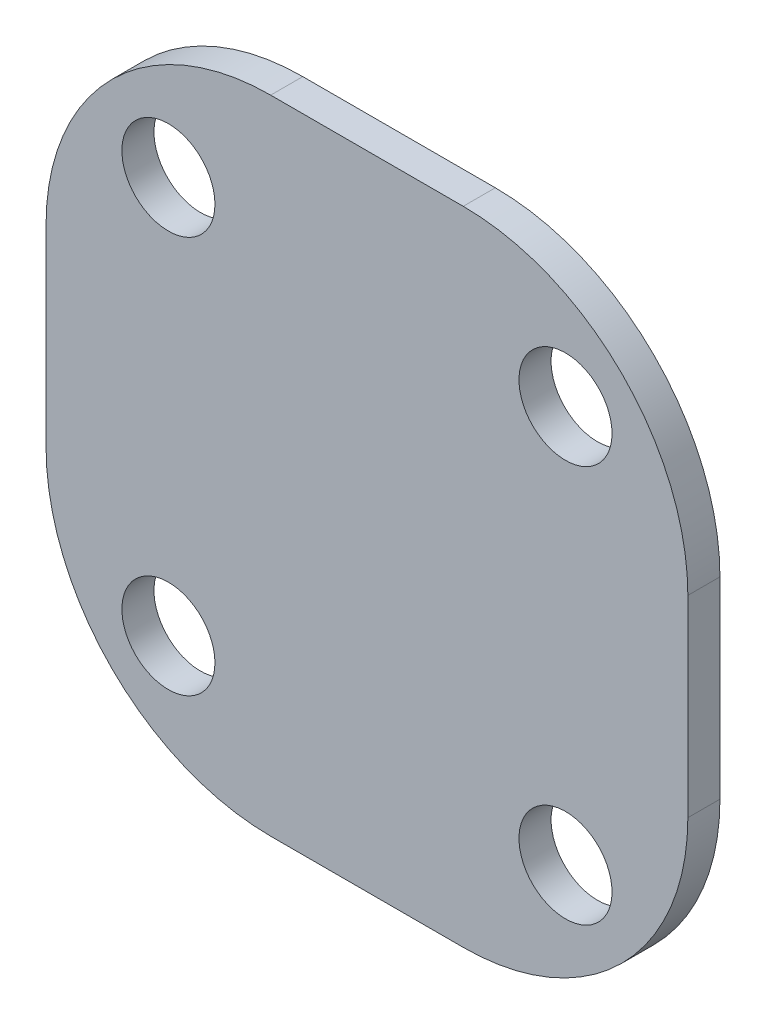
ISO-10303-21;
HEADER;
FILE_DESCRIPTION(('STEP AP214'),'2;1');
FILE_NAME('part.step','',(''),(''),'','','');
FILE_SCHEMA(('AUTOMOTIVE_DESIGN { 1 0 10303 214 1 1 1 1 }'));
ENDSEC;
DATA;
#1=APPLICATION_CONTEXT('core data for automotive mechanical design processes');
#2=APPLICATION_PROTOCOL_DEFINITION('international standard','automotive_design',2000,#1);
#3=PRODUCT_CONTEXT('',#1,'mechanical');
#4=PRODUCT('Part','Part','',(#3));
#5=PRODUCT_RELATED_PRODUCT_CATEGORY('part','',(#4));
#6=PRODUCT_DEFINITION_FORMATION('','',#4);
#7=PRODUCT_DEFINITION_CONTEXT('part definition',#1,'design');
#8=PRODUCT_DEFINITION('design','',#6,#7);
#9=PRODUCT_DEFINITION_SHAPE('','',#8);
#10=(LENGTH_UNIT() NAMED_UNIT(*) SI_UNIT(.MILLI.,.METRE.));
#11=(NAMED_UNIT(*) PLANE_ANGLE_UNIT() SI_UNIT($,.RADIAN.));
#12=(NAMED_UNIT(*) SI_UNIT($,.STERADIAN.) SOLID_ANGLE_UNIT());
#13=UNCERTAINTY_MEASURE_WITH_UNIT(LENGTH_MEASURE(1.E-05),#10,'distance_accuracy_value','');
#14=(GEOMETRIC_REPRESENTATION_CONTEXT(3) GLOBAL_UNCERTAINTY_ASSIGNED_CONTEXT((#13)) GLOBAL_UNIT_ASSIGNED_CONTEXT((#10,
#11,#12)) REPRESENTATION_CONTEXT('',''));
#15=CARTESIAN_POINT('',(0.,0.,0.));
#16=DIRECTION('',(0.,0.,1.));
#17=DIRECTION('',(1.,0.,0.));
#18=AXIS2_PLACEMENT_3D('',#15,#16,#17);
#19=CARTESIAN_POINT('',(0.,0.,1.27));
#20=DIRECTION('',(1.,0.,0.));
#21=DIRECTION('',(0.,1.,0.));
#22=AXIS2_PLACEMENT_3D('',#19,#20,#21);
#23=PLANE('',#22);
#24=DIRECTION('',(0.,-1.,0.));
#25=VECTOR('',#24,1.);
#26=CARTESIAN_POINT('',(0.,0.,0.));
#27=LINE('',#26,#25);
#28=CARTESIAN_POINT('',(0.,-8.89,0.));
#29=VERTEX_POINT('',#28);
#30=CARTESIAN_POINT('',(0.,-16.51,0.));
#31=VERTEX_POINT('',#30);
#32=EDGE_CURVE('E125',#29,#31,#27,.T.);
#33=ORIENTED_EDGE('',*,*,#32,.T.);
#34=DIRECTION('',(0.,0.,-1.));
#35=VECTOR('',#34,1.);
#36=CARTESIAN_POINT('',(0.,-16.51,1.27));
#37=LINE('',#36,#35);
#38=CARTESIAN_POINT('',(0.,-16.51,1.27));
#39=VERTEX_POINT('',#38);
#40=EDGE_CURVE('E103',#31,#39,#37,.F.);
#41=ORIENTED_EDGE('',*,*,#40,.T.);
#42=DIRECTION('',(0.,-1.,0.));
#43=VECTOR('',#42,1.);
#44=CARTESIAN_POINT('',(0.,0.,1.27));
#45=LINE('',#44,#43);
#46=CARTESIAN_POINT('',(0.,-8.89,1.27));
#47=VERTEX_POINT('',#46);
#48=EDGE_CURVE('E135',#47,#39,#45,.T.);
#49=ORIENTED_EDGE('',*,*,#48,.F.);
#50=DIRECTION('',(0.,0.,-1.));
#51=VECTOR('',#50,1.);
#52=CARTESIAN_POINT('',(0.,-8.89,1.27));
#53=LINE('',#52,#51);
#54=EDGE_CURVE('E108',#47,#29,#53,.T.);
#55=ORIENTED_EDGE('',*,*,#54,.T.);
#56=EDGE_LOOP('',(#33,#41,#49,#55));
#57=FACE_BOUND('',#56,.T.);
#58=ADVANCED_FACE('F33',(#57),#23,.F.);
#59=CARTESIAN_POINT('',(0.,-25.4,1.27));
#60=DIRECTION('',(0.,1.,0.));
#61=DIRECTION('',(0.,0.,1.));
#62=AXIS2_PLACEMENT_3D('',#59,#60,#61);
#63=PLANE('',#62);
#64=DIRECTION('',(1.,0.,0.));
#65=VECTOR('',#64,1.);
#66=CARTESIAN_POINT('',(0.,-25.4,1.27));
#67=LINE('',#66,#65);
#68=CARTESIAN_POINT('',(8.89,-25.4,1.27));
#69=VERTEX_POINT('',#68);
#70=CARTESIAN_POINT('',(16.51,-25.4,1.27));
#71=VERTEX_POINT('',#70);
#72=EDGE_CURVE('E118',#69,#71,#67,.T.);
#73=ORIENTED_EDGE('',*,*,#72,.F.);
#74=DIRECTION('',(0.,0.,-1.));
#75=VECTOR('',#74,1.);
#76=CARTESIAN_POINT('',(8.89,-25.4,1.27));
#77=LINE('',#76,#75);
#78=CARTESIAN_POINT('',(8.89,-25.4,0.));
#79=VERTEX_POINT('',#78);
#80=EDGE_CURVE('E102',#69,#79,#77,.T.);
#81=ORIENTED_EDGE('',*,*,#80,.T.);
#82=DIRECTION('',(1.,0.,0.));
#83=VECTOR('',#82,1.);
#84=CARTESIAN_POINT('',(0.,-25.4,0.));
#85=LINE('',#84,#83);
#86=CARTESIAN_POINT('',(16.51,-25.4,0.));
#87=VERTEX_POINT('',#86);
#88=EDGE_CURVE('E115',#79,#87,#85,.T.);
#89=ORIENTED_EDGE('',*,*,#88,.T.);
#90=DIRECTION('',(0.,0.,-1.));
#91=VECTOR('',#90,1.);
#92=CARTESIAN_POINT('',(16.51,-25.4,1.27));
#93=LINE('',#92,#91);
#94=EDGE_CURVE('E120',#87,#71,#93,.F.);
#95=ORIENTED_EDGE('',*,*,#94,.T.);
#96=EDGE_LOOP('',(#73,#81,#89,#95));
#97=FACE_BOUND('',#96,.T.);
#98=ADVANCED_FACE('F114',(#97),#63,.F.);
#99=CARTESIAN_POINT('',(25.4,0.,1.27));
#100=DIRECTION('',(-1.,0.,0.));
#101=DIRECTION('',(0.,0.,1.));
#102=AXIS2_PLACEMENT_3D('',#99,#100,#101);
#103=PLANE('',#102);
#104=DIRECTION('',(0.,1.,0.));
#105=VECTOR('',#104,1.);
#106=CARTESIAN_POINT('',(25.4,0.,1.27));
#107=LINE('',#106,#105);
#108=CARTESIAN_POINT('',(25.4,-16.51,1.27));
#109=VERTEX_POINT('',#108);
#110=CARTESIAN_POINT('',(25.4,-8.89,1.27));
#111=VERTEX_POINT('',#110);
#112=EDGE_CURVE('E169',#109,#111,#107,.T.);
#113=ORIENTED_EDGE('',*,*,#112,.F.);
#114=DIRECTION('',(0.,0.,-1.));
#115=VECTOR('',#114,1.);
#116=CARTESIAN_POINT('',(25.4,-16.51,1.27));
#117=LINE('',#116,#115);
#118=CARTESIAN_POINT('',(25.4,-16.51,0.));
#119=VERTEX_POINT('',#118);
#120=EDGE_CURVE('E154',#109,#119,#117,.T.);
#121=ORIENTED_EDGE('',*,*,#120,.T.);
#122=DIRECTION('',(0.,1.,0.));
#123=VECTOR('',#122,1.);
#124=CARTESIAN_POINT('',(25.4,0.,0.));
#125=LINE('',#124,#123);
#126=CARTESIAN_POINT('',(25.4,-8.89,0.));
#127=VERTEX_POINT('',#126);
#128=EDGE_CURVE('E124',#119,#127,#125,.T.);
#129=ORIENTED_EDGE('',*,*,#128,.T.);
#130=DIRECTION('',(0.,0.,-1.));
#131=VECTOR('',#130,1.);
#132=CARTESIAN_POINT('',(25.4,-8.89,1.27));
#133=LINE('',#132,#131);
#134=EDGE_CURVE('E152',#127,#111,#133,.F.);
#135=ORIENTED_EDGE('',*,*,#134,.T.);
#136=EDGE_LOOP('',(#113,#121,#129,#135));
#137=FACE_BOUND('',#136,.T.);
#138=ADVANCED_FACE('F185',(#137),#103,.F.);
#139=CARTESIAN_POINT('',(0.,0.,1.27));
#140=DIRECTION('',(0.,-1.,0.));
#141=DIRECTION('',(0.,0.,-1.));
#142=AXIS2_PLACEMENT_3D('',#139,#140,#141);
#143=PLANE('',#142);
#144=DIRECTION('',(-1.,0.,0.));
#145=VECTOR('',#144,1.);
#146=CARTESIAN_POINT('',(0.,0.,0.));
#147=LINE('',#146,#145);
#148=CARTESIAN_POINT('',(16.51,0.,0.));
#149=VERTEX_POINT('',#148);
#150=CARTESIAN_POINT('',(8.89,0.,0.));
#151=VERTEX_POINT('',#150);
#152=EDGE_CURVE('E128',#149,#151,#147,.T.);
#153=ORIENTED_EDGE('',*,*,#152,.T.);
#154=DIRECTION('',(0.,0.,-1.));
#155=VECTOR('',#154,1.);
#156=CARTESIAN_POINT('',(8.89,0.,1.27));
#157=LINE('',#156,#155);
#158=CARTESIAN_POINT('',(8.89,0.,1.27));
#159=VERTEX_POINT('',#158);
#160=EDGE_CURVE('E11',#151,#159,#157,.F.);
#161=ORIENTED_EDGE('',*,*,#160,.T.);
#162=DIRECTION('',(-1.,0.,0.));
#163=VECTOR('',#162,1.);
#164=CARTESIAN_POINT('',(0.,0.,1.27));
#165=LINE('',#164,#163);
#166=CARTESIAN_POINT('',(16.51,0.,1.27));
#167=VERTEX_POINT('',#166);
#168=EDGE_CURVE('E136',#167,#159,#165,.T.);
#169=ORIENTED_EDGE('',*,*,#168,.F.);
#170=DIRECTION('',(0.,0.,-1.));
#171=VECTOR('',#170,1.);
#172=CARTESIAN_POINT('',(16.51,0.,1.27));
#173=LINE('',#172,#171);
#174=EDGE_CURVE('E41',#167,#149,#173,.T.);
#175=ORIENTED_EDGE('',*,*,#174,.T.);
#176=EDGE_LOOP('',(#153,#161,#169,#175));
#177=FACE_BOUND('',#176,.T.);
#178=ADVANCED_FACE('F159',(#177),#143,.F.);
#179=CARTESIAN_POINT('',(0.,-25.4,1.27));
#180=DIRECTION('',(0.,0.,1.));
#181=DIRECTION('',(1.,0.,0.));
#182=AXIS2_PLACEMENT_3D('',#179,#180,#181);
#183=PLANE('',#182);
#184=CARTESIAN_POINT('',(20.5577241059356,-20.5577241059355,1.27));
#185=DIRECTION('',(0.,0.,1.));
#186=DIRECTION('',(1.,0.,0.));
#187=AXIS2_PLACEMENT_3D('',#184,#185,#186);
#188=CIRCLE('',#187,1.8415);
#189=CARTESIAN_POINT('',(22.3992241059356,-20.5577241059355,1.27));
#190=VERTEX_POINT('',#189);
#191=EDGE_CURVE('E318',#190,#190,#188,.T.);
#192=ORIENTED_EDGE('',*,*,#191,.F.);
#193=EDGE_LOOP('',(#192));
#194=FACE_BOUND('',#193,.T.);
#195=CARTESIAN_POINT('',(4.84227589406453,-20.5577241059355,1.27));
#196=DIRECTION('',(0.,0.,1.));
#197=DIRECTION('',(1.,0.,0.));
#198=AXIS2_PLACEMENT_3D('',#195,#196,#197);
#199=CIRCLE('',#198,1.8415);
#200=CARTESIAN_POINT('',(6.68377589406453,-20.5577241059355,1.27));
#201=VERTEX_POINT('',#200);
#202=EDGE_CURVE('E312',#201,#201,#199,.T.);
#203=ORIENTED_EDGE('',*,*,#202,.F.);
#204=EDGE_LOOP('',(#203));
#205=FACE_BOUND('',#204,.T.);
#206=CARTESIAN_POINT('',(4.84227589406458,-4.84227589406448,1.27));
#207=DIRECTION('',(0.,0.,1.));
#208=DIRECTION('',(1.,0.,0.));
#209=AXIS2_PLACEMENT_3D('',#206,#207,#208);
#210=CIRCLE('',#209,1.8415);
#211=CARTESIAN_POINT('',(6.68377589406458,-4.84227589406448,1.27));
#212=VERTEX_POINT('',#211);
#213=EDGE_CURVE('E304',#212,#212,#210,.T.);
#214=ORIENTED_EDGE('',*,*,#213,.F.);
#215=EDGE_LOOP('',(#214));
#216=FACE_BOUND('',#215,.T.);
#217=CARTESIAN_POINT('',(20.5577241059355,-4.84227589406447,1.27));
#218=DIRECTION('',(0.,0.,1.));
#219=DIRECTION('',(1.,0.,0.));
#220=AXIS2_PLACEMENT_3D('',#217,#218,#219);
#221=CIRCLE('',#220,1.8415);
#222=CARTESIAN_POINT('',(22.3992241059355,-4.84227589406447,1.27));
#223=VERTEX_POINT('',#222);
#224=EDGE_CURVE('E298',#223,#223,#221,.T.);
#225=ORIENTED_EDGE('',*,*,#224,.F.);
#226=EDGE_LOOP('',(#225));
#227=FACE_BOUND('',#226,.T.);
#228=ORIENTED_EDGE('',*,*,#48,.T.);
#229=CARTESIAN_POINT('',(8.89,-16.51,1.27));
#230=DIRECTION('',(0.,0.,1.));
#231=DIRECTION('',(1.,0.,0.));
#232=AXIS2_PLACEMENT_3D('',#229,#230,#231);
#233=CIRCLE('',#232,8.89);
#234=EDGE_CURVE('E150',#39,#69,#233,.T.);
#235=ORIENTED_EDGE('',*,*,#234,.T.);
#236=ORIENTED_EDGE('',*,*,#72,.T.);
#237=CARTESIAN_POINT('',(16.51,-16.51,1.27));
#238=DIRECTION('',(0.,0.,1.));
#239=DIRECTION('',(1.,0.,0.));
#240=AXIS2_PLACEMENT_3D('',#237,#238,#239);
#241=CIRCLE('',#240,8.89);
#242=EDGE_CURVE('E148',#71,#109,#241,.T.);
#243=ORIENTED_EDGE('',*,*,#242,.T.);
#244=ORIENTED_EDGE('',*,*,#112,.T.);
#245=CARTESIAN_POINT('',(16.51,-8.89,1.27));
#246=DIRECTION('',(0.,0.,1.));
#247=DIRECTION('',(1.,0.,0.));
#248=AXIS2_PLACEMENT_3D('',#245,#246,#247);
#249=CIRCLE('',#248,8.89);
#250=EDGE_CURVE('E53',#111,#167,#249,.T.);
#251=ORIENTED_EDGE('',*,*,#250,.T.);
#252=ORIENTED_EDGE('',*,*,#168,.T.);
#253=CARTESIAN_POINT('',(8.89,-8.89,1.27));
#254=DIRECTION('',(0.,0.,1.));
#255=DIRECTION('',(1.,0.,0.));
#256=AXIS2_PLACEMENT_3D('',#253,#254,#255);
#257=CIRCLE('',#256,8.89);
#258=EDGE_CURVE('E146',#159,#47,#257,.T.);
#259=ORIENTED_EDGE('',*,*,#258,.T.);
#260=EDGE_LOOP('',(#228,#235,#236,#243,#244,#251,#252,#259));
#261=FACE_BOUND('',#260,.T.);
#262=ADVANCED_FACE('F174',(#194,#205,#216,#227,#261),#183,.T.);
#263=CARTESIAN_POINT('',(0.,-25.4,0.));
#264=DIRECTION('',(0.,0.,1.));
#265=DIRECTION('',(1.,0.,0.));
#266=AXIS2_PLACEMENT_3D('',#263,#264,#265);
#267=PLANE('',#266);
#268=CARTESIAN_POINT('',(20.5577241059356,-20.5577241059355,0.));
#269=DIRECTION('',(0.,0.,1.));
#270=DIRECTION('',(1.,0.,0.));
#271=AXIS2_PLACEMENT_3D('',#268,#269,#270);
#272=CIRCLE('',#271,1.8415);
#273=CARTESIAN_POINT('',(22.3992241059356,-20.5577241059355,0.));
#274=VERTEX_POINT('',#273);
#275=EDGE_CURVE('E315',#274,#274,#272,.F.);
#276=ORIENTED_EDGE('',*,*,#275,.F.);
#277=EDGE_LOOP('',(#276));
#278=FACE_BOUND('',#277,.T.);
#279=CARTESIAN_POINT('',(4.84227589406453,-20.5577241059355,0.));
#280=DIRECTION('',(0.,0.,1.));
#281=DIRECTION('',(1.,0.,0.));
#282=AXIS2_PLACEMENT_3D('',#279,#280,#281);
#283=CIRCLE('',#282,1.8415);
#284=CARTESIAN_POINT('',(6.68377589406453,-20.5577241059355,0.));
#285=VERTEX_POINT('',#284);
#286=EDGE_CURVE('E309',#285,#285,#283,.F.);
#287=ORIENTED_EDGE('',*,*,#286,.F.);
#288=EDGE_LOOP('',(#287));
#289=FACE_BOUND('',#288,.T.);
#290=CARTESIAN_POINT('',(4.84227589406458,-4.84227589406448,0.));
#291=DIRECTION('',(0.,0.,1.));
#292=DIRECTION('',(1.,0.,0.));
#293=AXIS2_PLACEMENT_3D('',#290,#291,#292);
#294=CIRCLE('',#293,1.8415);
#295=CARTESIAN_POINT('',(6.68377589406458,-4.84227589406448,0.));
#296=VERTEX_POINT('',#295);
#297=EDGE_CURVE('E302',#296,#296,#294,.F.);
#298=ORIENTED_EDGE('',*,*,#297,.F.);
#299=EDGE_LOOP('',(#298));
#300=FACE_BOUND('',#299,.T.);
#301=CARTESIAN_POINT('',(20.5577241059355,-4.84227589406447,0.));
#302=DIRECTION('',(0.,0.,1.));
#303=DIRECTION('',(1.,0.,0.));
#304=AXIS2_PLACEMENT_3D('',#301,#302,#303);
#305=CIRCLE('',#304,1.8415);
#306=CARTESIAN_POINT('',(22.3992241059355,-4.84227589406447,0.));
#307=VERTEX_POINT('',#306);
#308=EDGE_CURVE('E130',#307,#307,#305,.F.);
#309=ORIENTED_EDGE('',*,*,#308,.F.);
#310=EDGE_LOOP('',(#309));
#311=FACE_BOUND('',#310,.T.);
#312=ORIENTED_EDGE('',*,*,#88,.F.);
#313=CARTESIAN_POINT('',(8.89,-16.51,0.));
#314=DIRECTION('',(0.,0.,1.));
#315=DIRECTION('',(1.,0.,0.));
#316=AXIS2_PLACEMENT_3D('',#313,#314,#315);
#317=CIRCLE('',#316,8.89);
#318=EDGE_CURVE('E98',#79,#31,#317,.F.);
#319=ORIENTED_EDGE('',*,*,#318,.T.);
#320=ORIENTED_EDGE('',*,*,#32,.F.);
#321=CARTESIAN_POINT('',(8.89,-8.89,0.));
#322=DIRECTION('',(0.,0.,1.));
#323=DIRECTION('',(1.,0.,0.));
#324=AXIS2_PLACEMENT_3D('',#321,#322,#323);
#325=CIRCLE('',#324,8.89);
#326=EDGE_CURVE('E139',#29,#151,#325,.F.);
#327=ORIENTED_EDGE('',*,*,#326,.T.);
#328=ORIENTED_EDGE('',*,*,#152,.F.);
#329=CARTESIAN_POINT('',(16.51,-8.89,0.));
#330=DIRECTION('',(0.,0.,1.));
#331=DIRECTION('',(1.,0.,0.));
#332=AXIS2_PLACEMENT_3D('',#329,#330,#331);
#333=CIRCLE('',#332,8.89);
#334=EDGE_CURVE('E119',#149,#127,#333,.F.);
#335=ORIENTED_EDGE('',*,*,#334,.T.);
#336=ORIENTED_EDGE('',*,*,#128,.F.);
#337=CARTESIAN_POINT('',(16.51,-16.51,0.));
#338=DIRECTION('',(0.,0.,1.));
#339=DIRECTION('',(1.,0.,0.));
#340=AXIS2_PLACEMENT_3D('',#337,#338,#339);
#341=CIRCLE('',#340,8.89);
#342=EDGE_CURVE('E109',#119,#87,#341,.F.);
#343=ORIENTED_EDGE('',*,*,#342,.T.);
#344=EDGE_LOOP('',(#312,#319,#320,#327,#328,#335,#336,#343));
#345=FACE_BOUND('',#344,.T.);
#346=ADVANCED_FACE('F122',(#278,#289,#300,#311,#345),#267,.F.);
#347=CARTESIAN_POINT('',(20.5577241059355,-4.84227589406447,-0.000999999999999916));
#348=DIRECTION('',(0.,0.,1.));
#349=DIRECTION('',(1.,0.,0.));
#350=AXIS2_PLACEMENT_3D('',#347,#348,#349);
#351=CYLINDRICAL_SURFACE('',#350,1.8415);
#352=ORIENTED_EDGE('',*,*,#224,.T.);
#353=EDGE_LOOP('',(#352));
#354=FACE_BOUND('',#353,.T.);
#355=ORIENTED_EDGE('',*,*,#308,.T.);
#356=EDGE_LOOP('',(#355));
#357=FACE_BOUND('',#356,.T.);
#358=ADVANCED_FACE('F182',(#354,#357),#351,.F.);
#359=CARTESIAN_POINT('',(4.84227589406458,-4.84227589406448,-0.000999999999999916));
#360=DIRECTION('',(0.,0.,1.));
#361=DIRECTION('',(1.,0.,0.));
#362=AXIS2_PLACEMENT_3D('',#359,#360,#361);
#363=CYLINDRICAL_SURFACE('',#362,1.8415);
#364=ORIENTED_EDGE('',*,*,#213,.T.);
#365=EDGE_LOOP('',(#364));
#366=FACE_BOUND('',#365,.T.);
#367=ORIENTED_EDGE('',*,*,#297,.T.);
#368=EDGE_LOOP('',(#367));
#369=FACE_BOUND('',#368,.T.);
#370=ADVANCED_FACE('F272',(#366,#369),#363,.F.);
#371=CARTESIAN_POINT('',(4.84227589406453,-20.5577241059355,-0.000999999999999916));
#372=DIRECTION('',(0.,0.,1.));
#373=DIRECTION('',(1.,0.,0.));
#374=AXIS2_PLACEMENT_3D('',#371,#372,#373);
#375=CYLINDRICAL_SURFACE('',#374,1.8415);
#376=ORIENTED_EDGE('',*,*,#202,.T.);
#377=EDGE_LOOP('',(#376));
#378=FACE_BOUND('',#377,.T.);
#379=ORIENTED_EDGE('',*,*,#286,.T.);
#380=EDGE_LOOP('',(#379));
#381=FACE_BOUND('',#380,.T.);
#382=ADVANCED_FACE('F265',(#378,#381),#375,.F.);
#383=CARTESIAN_POINT('',(20.5577241059356,-20.5577241059355,-0.000999999999999916));
#384=DIRECTION('',(0.,0.,1.));
#385=DIRECTION('',(1.,0.,0.));
#386=AXIS2_PLACEMENT_3D('',#383,#384,#385);
#387=CYLINDRICAL_SURFACE('',#386,1.8415);
#388=ORIENTED_EDGE('',*,*,#191,.T.);
#389=EDGE_LOOP('',(#388));
#390=FACE_BOUND('',#389,.T.);
#391=ORIENTED_EDGE('',*,*,#275,.T.);
#392=EDGE_LOOP('',(#391));
#393=FACE_BOUND('',#392,.T.);
#394=ADVANCED_FACE('F201',(#390,#393),#387,.F.);
#395=CARTESIAN_POINT('',(8.89,-16.51,1.27));
#396=DIRECTION('',(0.,0.,-1.));
#397=DIRECTION('',(-1.,0.,0.));
#398=AXIS2_PLACEMENT_3D('',#395,#396,#397);
#399=CYLINDRICAL_SURFACE('',#398,8.89);
#400=ORIENTED_EDGE('',*,*,#234,.F.);
#401=ORIENTED_EDGE('',*,*,#40,.F.);
#402=ORIENTED_EDGE('',*,*,#318,.F.);
#403=ORIENTED_EDGE('',*,*,#80,.F.);
#404=EDGE_LOOP('',(#400,#401,#402,#403));
#405=FACE_BOUND('',#404,.T.);
#406=ADVANCED_FACE('F101',(#405),#399,.T.);
#407=CARTESIAN_POINT('',(16.51,-16.51,1.27));
#408=DIRECTION('',(0.,0.,-1.));
#409=DIRECTION('',(-1.,0.,0.));
#410=AXIS2_PLACEMENT_3D('',#407,#408,#409);
#411=CYLINDRICAL_SURFACE('',#410,8.89);
#412=ORIENTED_EDGE('',*,*,#242,.F.);
#413=ORIENTED_EDGE('',*,*,#94,.F.);
#414=ORIENTED_EDGE('',*,*,#342,.F.);
#415=ORIENTED_EDGE('',*,*,#120,.F.);
#416=EDGE_LOOP('',(#412,#413,#414,#415));
#417=FACE_BOUND('',#416,.T.);
#418=ADVANCED_FACE('F200',(#417),#411,.T.);
#419=CARTESIAN_POINT('',(8.89,-8.89,1.27));
#420=DIRECTION('',(0.,0.,-1.));
#421=DIRECTION('',(-1.,0.,0.));
#422=AXIS2_PLACEMENT_3D('',#419,#420,#421);
#423=CYLINDRICAL_SURFACE('',#422,8.89);
#424=ORIENTED_EDGE('',*,*,#258,.F.);
#425=ORIENTED_EDGE('',*,*,#160,.F.);
#426=ORIENTED_EDGE('',*,*,#326,.F.);
#427=ORIENTED_EDGE('',*,*,#54,.F.);
#428=EDGE_LOOP('',(#424,#425,#426,#427));
#429=FACE_BOUND('',#428,.T.);
#430=ADVANCED_FACE('F164',(#429),#423,.T.);
#431=CARTESIAN_POINT('',(16.51,-8.89,1.27));
#432=DIRECTION('',(0.,0.,-1.));
#433=DIRECTION('',(-1.,0.,0.));
#434=AXIS2_PLACEMENT_3D('',#431,#432,#433);
#435=CYLINDRICAL_SURFACE('',#434,8.89);
#436=ORIENTED_EDGE('',*,*,#250,.F.);
#437=ORIENTED_EDGE('',*,*,#134,.F.);
#438=ORIENTED_EDGE('',*,*,#334,.F.);
#439=ORIENTED_EDGE('',*,*,#174,.F.);
#440=EDGE_LOOP('',(#436,#437,#438,#439));
#441=FACE_BOUND('',#440,.T.);
#442=ADVANCED_FACE('F35',(#441),#435,.T.);
#443=CLOSED_SHELL('',(#58,#98,#138,#178,#262,#346,#358,#370,#382,#394,#406,#418,#430,#442));
#444=MANIFOLD_SOLID_BREP('B2',#443);
#445=ADVANCED_BREP_SHAPE_REPRESENTATION('',(#18,#444),#14);
#446=SHAPE_DEFINITION_REPRESENTATION(#9,#445);
ENDSEC;
END-ISO-10303-21;
